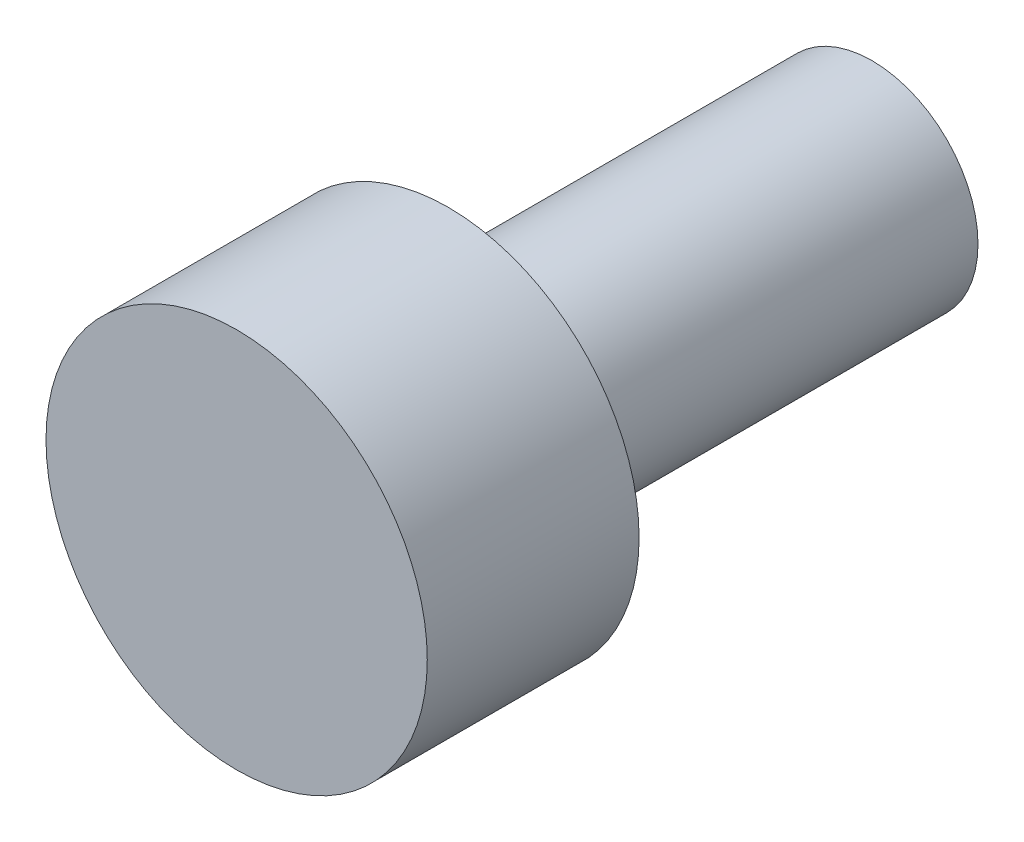
ISO-10303-21;
HEADER;
FILE_DESCRIPTION(('STEP AP214'),'2;1');
FILE_NAME('part.step','',(''),(''),'','','');
FILE_SCHEMA(('AUTOMOTIVE_DESIGN { 1 0 10303 214 1 1 1 1 }'));
ENDSEC;
DATA;
#1=APPLICATION_CONTEXT('core data for automotive mechanical design processes');
#2=APPLICATION_PROTOCOL_DEFINITION('international standard','automotive_design',2000,#1);
#3=PRODUCT_CONTEXT('',#1,'mechanical');
#4=PRODUCT('Part','Part','',(#3));
#5=PRODUCT_RELATED_PRODUCT_CATEGORY('part','',(#4));
#6=PRODUCT_DEFINITION_FORMATION('','',#4);
#7=PRODUCT_DEFINITION_CONTEXT('part definition',#1,'design');
#8=PRODUCT_DEFINITION('design','',#6,#7);
#9=PRODUCT_DEFINITION_SHAPE('','',#8);
#10=(LENGTH_UNIT() NAMED_UNIT(*) SI_UNIT(.MILLI.,.METRE.));
#11=(NAMED_UNIT(*) PLANE_ANGLE_UNIT() SI_UNIT($,.RADIAN.));
#12=(NAMED_UNIT(*) SI_UNIT($,.STERADIAN.) SOLID_ANGLE_UNIT());
#13=UNCERTAINTY_MEASURE_WITH_UNIT(LENGTH_MEASURE(1.E-05),#10,'distance_accuracy_value','');
#14=(GEOMETRIC_REPRESENTATION_CONTEXT(3) GLOBAL_UNCERTAINTY_ASSIGNED_CONTEXT((#13)) GLOBAL_UNIT_ASSIGNED_CONTEXT((#10,
#11,#12)) REPRESENTATION_CONTEXT('',''));
#15=CARTESIAN_POINT('',(0.,0.,0.));
#16=DIRECTION('',(0.,0.,1.));
#17=DIRECTION('',(1.,0.,0.));
#18=AXIS2_PLACEMENT_3D('',#15,#16,#17);
#19=CARTESIAN_POINT('',(0.,0.,2.));
#20=DIRECTION('',(0.,0.,-1.));
#21=DIRECTION('',(-1.,0.,0.));
#22=AXIS2_PLACEMENT_3D('',#19,#20,#21);
#23=CYLINDRICAL_SURFACE('',#22,1.8);
#24=CARTESIAN_POINT('',(0.,0.,2.));
#25=DIRECTION('',(0.,0.,1.));
#26=DIRECTION('',(1.,0.,0.));
#27=AXIS2_PLACEMENT_3D('',#24,#25,#26);
#28=CIRCLE('',#27,1.8);
#29=CARTESIAN_POINT('',(1.8,0.,2.));
#30=VERTEX_POINT('',#29);
#31=EDGE_CURVE('E43',#30,#30,#28,.T.);
#32=ORIENTED_EDGE('',*,*,#31,.F.);
#33=EDGE_LOOP('',(#32));
#34=FACE_BOUND('',#33,.T.);
#35=CARTESIAN_POINT('',(0.,0.,0.));
#36=DIRECTION('',(0.,0.,1.));
#37=DIRECTION('',(1.,0.,0.));
#38=AXIS2_PLACEMENT_3D('',#35,#36,#37);
#39=CIRCLE('',#38,1.8);
#40=CARTESIAN_POINT('',(1.8,0.,0.));
#41=VERTEX_POINT('',#40);
#42=EDGE_CURVE('E39',#41,#41,#39,.T.);
#43=ORIENTED_EDGE('',*,*,#42,.T.);
#44=EDGE_LOOP('',(#43));
#45=FACE_BOUND('',#44,.T.);
#46=ADVANCED_FACE('F36',(#34,#45),#23,.T.);
#47=CARTESIAN_POINT('',(0.,0.,2.));
#48=DIRECTION('',(0.,0.,1.));
#49=DIRECTION('',(1.,0.,0.));
#50=AXIS2_PLACEMENT_3D('',#47,#48,#49);
#51=PLANE('',#50);
#52=ORIENTED_EDGE('',*,*,#31,.T.);
#53=EDGE_LOOP('',(#52));
#54=FACE_BOUND('',#53,.T.);
#55=ADVANCED_FACE('F60',(#54),#51,.T.);
#56=CARTESIAN_POINT('',(0.,0.,0.));
#57=DIRECTION('',(0.,0.,1.));
#58=DIRECTION('',(1.,0.,0.));
#59=AXIS2_PLACEMENT_3D('',#56,#57,#58);
#60=PLANE('',#59);
#61=CARTESIAN_POINT('',(0.,0.,0.));
#62=DIRECTION('',(0.,0.,-1.));
#63=DIRECTION('',(-1.,0.,0.));
#64=AXIS2_PLACEMENT_3D('',#61,#62,#63);
#65=CIRCLE('',#64,1.);
#66=CARTESIAN_POINT('',(-1.,0.,0.));
#67=VERTEX_POINT('',#66);
#68=EDGE_CURVE('E10',#67,#67,#65,.T.);
#69=ORIENTED_EDGE('',*,*,#68,.F.);
#70=EDGE_LOOP('',(#69));
#71=FACE_BOUND('',#70,.T.);
#72=ORIENTED_EDGE('',*,*,#42,.F.);
#73=EDGE_LOOP('',(#72));
#74=FACE_BOUND('',#73,.T.);
#75=ADVANCED_FACE('F57',(#71,#74),#60,.F.);
#76=CARTESIAN_POINT('',(0.,0.,-4.));
#77=DIRECTION('',(0.,0.,1.));
#78=DIRECTION('',(1.,0.,0.));
#79=AXIS2_PLACEMENT_3D('',#76,#77,#78);
#80=CYLINDRICAL_SURFACE('',#79,1.);
#81=CARTESIAN_POINT('',(0.,0.,-4.));
#82=DIRECTION('',(0.,0.,-1.));
#83=DIRECTION('',(-1.,0.,0.));
#84=AXIS2_PLACEMENT_3D('',#81,#82,#83);
#85=CIRCLE('',#84,1.);
#86=CARTESIAN_POINT('',(-1.,0.,-4.));
#87=VERTEX_POINT('',#86);
#88=EDGE_CURVE('E49',#87,#87,#85,.T.);
#89=ORIENTED_EDGE('',*,*,#88,.F.);
#90=EDGE_LOOP('',(#89));
#91=FACE_BOUND('',#90,.T.);
#92=ORIENTED_EDGE('',*,*,#68,.T.);
#93=EDGE_LOOP('',(#92));
#94=FACE_BOUND('',#93,.T.);
#95=ADVANCED_FACE('F59',(#91,#94),#80,.T.);
#96=CARTESIAN_POINT('',(0.,0.,-4.));
#97=DIRECTION('',(0.,0.,-1.));
#98=DIRECTION('',(-1.,0.,0.));
#99=AXIS2_PLACEMENT_3D('',#96,#97,#98);
#100=PLANE('',#99);
#101=ORIENTED_EDGE('',*,*,#88,.T.);
#102=EDGE_LOOP('',(#101));
#103=FACE_BOUND('',#102,.T.);
#104=ADVANCED_FACE('F66',(#103),#100,.T.);
#105=CLOSED_SHELL('',(#46,#55,#75,#95,#104));
#106=MANIFOLD_SOLID_BREP('B2',#105);
#107=ADVANCED_BREP_SHAPE_REPRESENTATION('',(#18,#106),#14);
#108=SHAPE_DEFINITION_REPRESENTATION(#9,#107);
ENDSEC;
END-ISO-10303-21;
